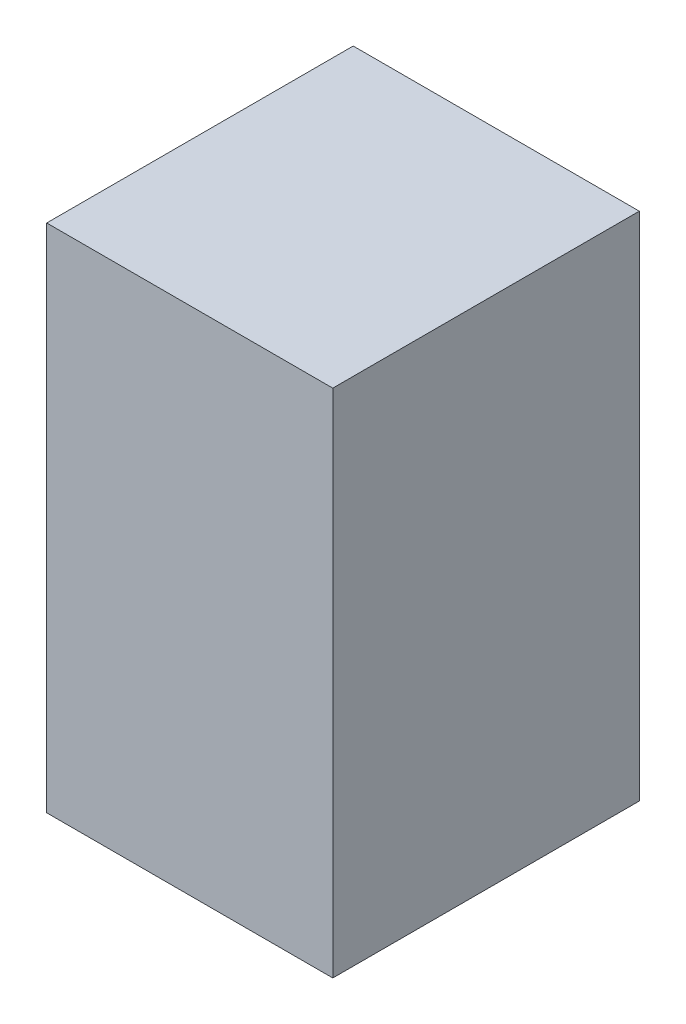
ISO-10303-21;
HEADER;
FILE_DESCRIPTION(('STEP AP214'),'2;1');
FILE_NAME('part.step','',(''),(''),'','','');
FILE_SCHEMA(('AUTOMOTIVE_DESIGN { 1 0 10303 214 1 1 1 1 }'));
ENDSEC;
DATA;
#1=APPLICATION_CONTEXT('core data for automotive mechanical design processes');
#2=APPLICATION_PROTOCOL_DEFINITION('international standard','automotive_design',2000,#1);
#3=PRODUCT_CONTEXT('',#1,'mechanical');
#4=PRODUCT('Part','Part','',(#3));
#5=PRODUCT_RELATED_PRODUCT_CATEGORY('part','',(#4));
#6=PRODUCT_DEFINITION_FORMATION('','',#4);
#7=PRODUCT_DEFINITION_CONTEXT('part definition',#1,'design');
#8=PRODUCT_DEFINITION('design','',#6,#7);
#9=PRODUCT_DEFINITION_SHAPE('','',#8);
#10=(LENGTH_UNIT() NAMED_UNIT(*) SI_UNIT(.MILLI.,.METRE.));
#11=(NAMED_UNIT(*) PLANE_ANGLE_UNIT() SI_UNIT($,.RADIAN.));
#12=(NAMED_UNIT(*) SI_UNIT($,.STERADIAN.) SOLID_ANGLE_UNIT());
#13=UNCERTAINTY_MEASURE_WITH_UNIT(LENGTH_MEASURE(1.E-05),#10,'distance_accuracy_value','');
#14=(GEOMETRIC_REPRESENTATION_CONTEXT(3) GLOBAL_UNCERTAINTY_ASSIGNED_CONTEXT((#13)) GLOBAL_UNIT_ASSIGNED_CONTEXT((#10,
#11,#12)) REPRESENTATION_CONTEXT('',''));
#15=CARTESIAN_POINT('',(0.,0.,0.));
#16=DIRECTION('',(0.,0.,1.));
#17=DIRECTION('',(1.,0.,0.));
#18=AXIS2_PLACEMENT_3D('',#15,#16,#17);
#19=CARTESIAN_POINT('',(714.,1540.,-70.));
#20=DIRECTION('',(-1.,0.,0.));
#21=DIRECTION('',(0.,0.,1.));
#22=AXIS2_PLACEMENT_3D('',#19,#20,#21);
#23=PLANE('',#22);
#24=DIRECTION('',(0.,-1.,0.));
#25=VECTOR('',#24,1.);
#26=CARTESIAN_POINT('',(714.,1540.,-55.));
#27=LINE('',#26,#25);
#28=CARTESIAN_POINT('',(714.,1565.,-55.));
#29=VERTEX_POINT('',#28);
#30=CARTESIAN_POINT('',(714.,1540.,-55.));
#31=VERTEX_POINT('',#30);
#32=EDGE_CURVE('E103',#29,#31,#27,.T.);
#33=ORIENTED_EDGE('',*,*,#32,.F.);
#34=DIRECTION('',(0.,0.,1.));
#35=VECTOR('',#34,1.);
#36=CARTESIAN_POINT('',(714.,1565.,-70.));
#37=LINE('',#36,#35);
#38=CARTESIAN_POINT('',(714.,1565.,-70.));
#39=VERTEX_POINT('',#38);
#40=EDGE_CURVE('E11',#39,#29,#37,.T.);
#41=ORIENTED_EDGE('',*,*,#40,.F.);
#42=DIRECTION('',(0.,-1.,0.));
#43=VECTOR('',#42,1.);
#44=CARTESIAN_POINT('',(714.,1540.,-70.));
#45=LINE('',#44,#43);
#46=CARTESIAN_POINT('',(714.,1540.,-70.));
#47=VERTEX_POINT('',#46);
#48=EDGE_CURVE('E97',#39,#47,#45,.T.);
#49=ORIENTED_EDGE('',*,*,#48,.T.);
#50=DIRECTION('',(0.,0.,1.));
#51=VECTOR('',#50,1.);
#52=CARTESIAN_POINT('',(714.,1540.,-70.));
#53=LINE('',#52,#51);
#54=EDGE_CURVE('E42',#47,#31,#53,.T.);
#55=ORIENTED_EDGE('',*,*,#54,.T.);
#56=EDGE_LOOP('',(#33,#41,#49,#55));
#57=FACE_BOUND('',#56,.T.);
#58=ADVANCED_FACE('F39',(#57),#23,.T.);
#59=CARTESIAN_POINT('',(714.,1565.,-70.));
#60=DIRECTION('',(0.,1.,0.));
#61=DIRECTION('',(0.,0.,1.));
#62=AXIS2_PLACEMENT_3D('',#59,#60,#61);
#63=PLANE('',#62);
#64=DIRECTION('',(-1.,0.,0.));
#65=VECTOR('',#64,1.);
#66=CARTESIAN_POINT('',(714.,1565.,-55.));
#67=LINE('',#66,#65);
#68=CARTESIAN_POINT('',(728.,1565.,-55.));
#69=VERTEX_POINT('',#68);
#70=EDGE_CURVE('E99',#69,#29,#67,.T.);
#71=ORIENTED_EDGE('',*,*,#70,.F.);
#72=DIRECTION('',(0.,0.,1.));
#73=VECTOR('',#72,1.);
#74=CARTESIAN_POINT('',(728.,1565.,-70.));
#75=LINE('',#74,#73);
#76=CARTESIAN_POINT('',(728.,1565.,-70.));
#77=VERTEX_POINT('',#76);
#78=EDGE_CURVE('E48',#77,#69,#75,.T.);
#79=ORIENTED_EDGE('',*,*,#78,.F.);
#80=DIRECTION('',(-1.,0.,0.));
#81=VECTOR('',#80,1.);
#82=CARTESIAN_POINT('',(714.,1565.,-70.));
#83=LINE('',#82,#81);
#84=EDGE_CURVE('E94',#77,#39,#83,.T.);
#85=ORIENTED_EDGE('',*,*,#84,.T.);
#86=ORIENTED_EDGE('',*,*,#40,.T.);
#87=EDGE_LOOP('',(#71,#79,#85,#86));
#88=FACE_BOUND('',#87,.T.);
#89=ADVANCED_FACE('F113',(#88),#63,.T.);
#90=CARTESIAN_POINT('',(728.,1540.,-70.));
#91=DIRECTION('',(1.,0.,0.));
#92=DIRECTION('',(0.,0.,-1.));
#93=AXIS2_PLACEMENT_3D('',#90,#91,#92);
#94=PLANE('',#93);
#95=DIRECTION('',(0.,1.,0.));
#96=VECTOR('',#95,1.);
#97=CARTESIAN_POINT('',(728.,1540.,-55.));
#98=LINE('',#97,#96);
#99=CARTESIAN_POINT('',(728.,1540.,-55.));
#100=VERTEX_POINT('',#99);
#101=EDGE_CURVE('E89',#100,#69,#98,.T.);
#102=ORIENTED_EDGE('',*,*,#101,.F.);
#103=DIRECTION('',(0.,0.,1.));
#104=VECTOR('',#103,1.);
#105=CARTESIAN_POINT('',(728.,1540.,-70.));
#106=LINE('',#105,#104);
#107=CARTESIAN_POINT('',(728.,1540.,-70.));
#108=VERTEX_POINT('',#107);
#109=EDGE_CURVE('E84',#108,#100,#106,.T.);
#110=ORIENTED_EDGE('',*,*,#109,.F.);
#111=DIRECTION('',(0.,1.,0.));
#112=VECTOR('',#111,1.);
#113=CARTESIAN_POINT('',(728.,1540.,-70.));
#114=LINE('',#113,#112);
#115=EDGE_CURVE('E87',#108,#77,#114,.T.);
#116=ORIENTED_EDGE('',*,*,#115,.T.);
#117=ORIENTED_EDGE('',*,*,#78,.T.);
#118=EDGE_LOOP('',(#102,#110,#116,#117));
#119=FACE_BOUND('',#118,.T.);
#120=ADVANCED_FACE('F86',(#119),#94,.T.);
#121=CARTESIAN_POINT('',(714.,1540.,-70.));
#122=DIRECTION('',(0.,-1.,0.));
#123=DIRECTION('',(0.,0.,-1.));
#124=AXIS2_PLACEMENT_3D('',#121,#122,#123);
#125=PLANE('',#124);
#126=DIRECTION('',(1.,0.,0.));
#127=VECTOR('',#126,1.);
#128=CARTESIAN_POINT('',(714.,1540.,-55.));
#129=LINE('',#128,#127);
#130=EDGE_CURVE('E106',#31,#100,#129,.T.);
#131=ORIENTED_EDGE('',*,*,#130,.F.);
#132=ORIENTED_EDGE('',*,*,#54,.F.);
#133=DIRECTION('',(1.,0.,0.));
#134=VECTOR('',#133,1.);
#135=CARTESIAN_POINT('',(714.,1540.,-70.));
#136=LINE('',#135,#134);
#137=EDGE_CURVE('E93',#47,#108,#136,.T.);
#138=ORIENTED_EDGE('',*,*,#137,.T.);
#139=ORIENTED_EDGE('',*,*,#109,.T.);
#140=EDGE_LOOP('',(#131,#132,#138,#139));
#141=FACE_BOUND('',#140,.T.);
#142=ADVANCED_FACE('F96',(#141),#125,.T.);
#143=CARTESIAN_POINT('',(0.,0.,-70.));
#144=DIRECTION('',(0.,0.,-1.));
#145=DIRECTION('',(-1.,0.,0.));
#146=AXIS2_PLACEMENT_3D('',#143,#144,#145);
#147=PLANE('',#146);
#148=ORIENTED_EDGE('',*,*,#48,.F.);
#149=ORIENTED_EDGE('',*,*,#84,.F.);
#150=ORIENTED_EDGE('',*,*,#115,.F.);
#151=ORIENTED_EDGE('',*,*,#137,.F.);
#152=EDGE_LOOP('',(#148,#149,#150,#151));
#153=FACE_BOUND('',#152,.T.);
#154=ADVANCED_FACE('F92',(#153),#147,.T.);
#155=CARTESIAN_POINT('',(0.,0.,-55.));
#156=DIRECTION('',(0.,0.,-1.));
#157=DIRECTION('',(-1.,0.,0.));
#158=AXIS2_PLACEMENT_3D('',#155,#156,#157);
#159=PLANE('',#158);
#160=ORIENTED_EDGE('',*,*,#32,.T.);
#161=ORIENTED_EDGE('',*,*,#130,.T.);
#162=ORIENTED_EDGE('',*,*,#101,.T.);
#163=ORIENTED_EDGE('',*,*,#70,.T.);
#164=EDGE_LOOP('',(#160,#161,#162,#163));
#165=FACE_BOUND('',#164,.T.);
#166=ADVANCED_FACE('F112',(#165),#159,.F.);
#167=CLOSED_SHELL('',(#58,#89,#120,#142,#154,#166));
#168=MANIFOLD_SOLID_BREP('B2',#167);
#169=ADVANCED_BREP_SHAPE_REPRESENTATION('',(#18,#168),#14);
#170=SHAPE_DEFINITION_REPRESENTATION(#9,#169);
ENDSEC;
END-ISO-10303-21;
